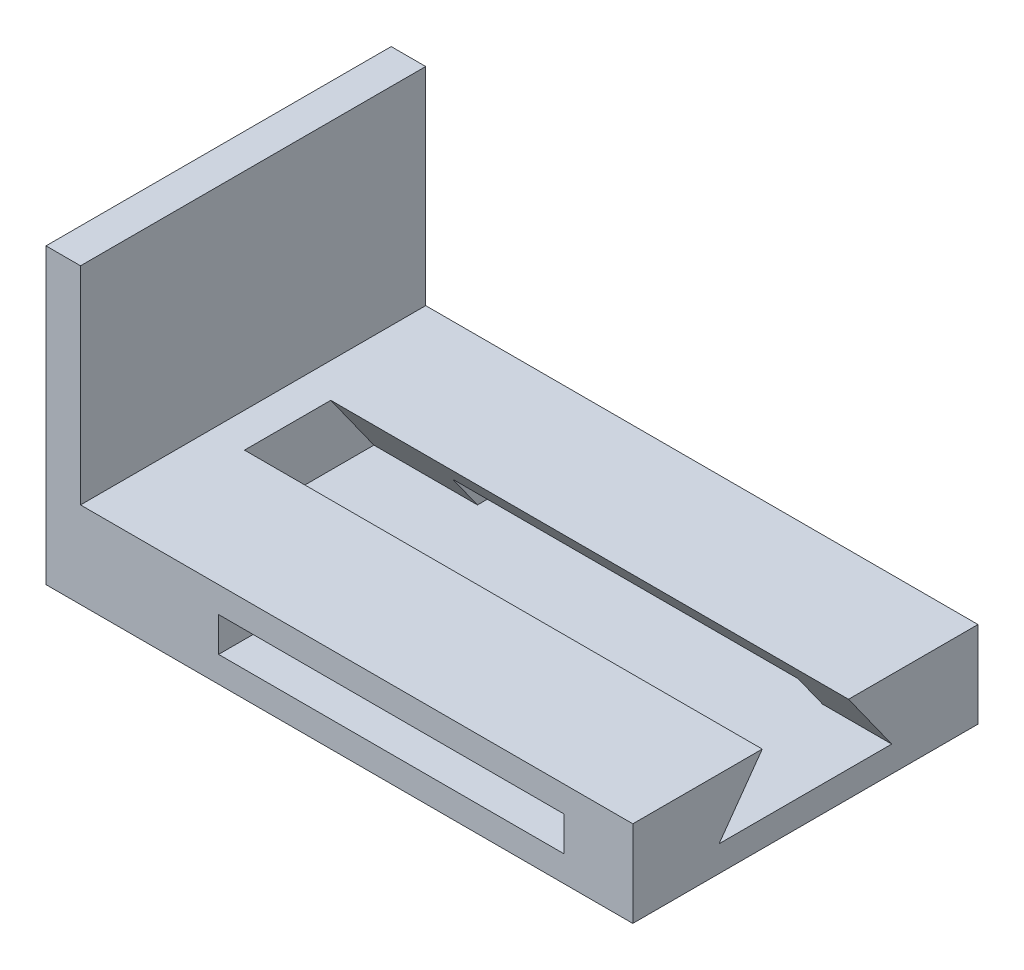
ISO-10303-21;
HEADER;
FILE_DESCRIPTION(('STEP AP214'),'2;1');
FILE_NAME('part.step','',(''),(''),'','','');
FILE_SCHEMA(('AUTOMOTIVE_DESIGN { 1 0 10303 214 1 1 1 1 }'));
ENDSEC;
DATA;
#1=APPLICATION_CONTEXT('core data for automotive mechanical design processes');
#2=APPLICATION_PROTOCOL_DEFINITION('international standard','automotive_design',2000,#1);
#3=PRODUCT_CONTEXT('',#1,'mechanical');
#4=PRODUCT('Part','Part','',(#3));
#5=PRODUCT_RELATED_PRODUCT_CATEGORY('part','',(#4));
#6=PRODUCT_DEFINITION_FORMATION('','',#4);
#7=PRODUCT_DEFINITION_CONTEXT('part definition',#1,'design');
#8=PRODUCT_DEFINITION('design','',#6,#7);
#9=PRODUCT_DEFINITION_SHAPE('','',#8);
#10=(LENGTH_UNIT() NAMED_UNIT(*) SI_UNIT(.MILLI.,.METRE.));
#11=(NAMED_UNIT(*) PLANE_ANGLE_UNIT() SI_UNIT($,.RADIAN.));
#12=(NAMED_UNIT(*) SI_UNIT($,.STERADIAN.) SOLID_ANGLE_UNIT());
#13=UNCERTAINTY_MEASURE_WITH_UNIT(LENGTH_MEASURE(1.E-05),#10,'distance_accuracy_value','');
#14=(GEOMETRIC_REPRESENTATION_CONTEXT(3) GLOBAL_UNCERTAINTY_ASSIGNED_CONTEXT((#13)) GLOBAL_UNIT_ASSIGNED_CONTEXT((#10,
#11,#12)) REPRESENTATION_CONTEXT('',''));
#15=CARTESIAN_POINT('',(0.,0.,0.));
#16=DIRECTION('',(0.,0.,1.));
#17=DIRECTION('',(1.,0.,0.));
#18=AXIS2_PLACEMENT_3D('',#15,#16,#17);
#19=CARTESIAN_POINT('',(2.,0.,0.));
#20=DIRECTION('',(0.,0.,-1.));
#21=DIRECTION('',(0.,1.,0.));
#22=AXIS2_PLACEMENT_3D('',#19,#20,#21);
#23=PLANE('',#22);
#24=DIRECTION('',(-1.,0.,0.));
#25=VECTOR('',#24,1.);
#26=CARTESIAN_POINT('',(10.,-15.5,0.));
#27=LINE('',#26,#25);
#28=CARTESIAN_POINT('',(30.,-15.5,0.));
#29=VERTEX_POINT('',#28);
#30=CARTESIAN_POINT('',(10.,-15.5,0.));
#31=VERTEX_POINT('',#30);
#32=EDGE_CURVE('E187',#29,#31,#27,.T.);
#33=ORIENTED_EDGE('',*,*,#32,.T.);
#34=DIRECTION('',(0.,1.,0.));
#35=VECTOR('',#34,1.);
#36=CARTESIAN_POINT('',(10.,-13.5,0.));
#37=LINE('',#36,#35);
#38=CARTESIAN_POINT('',(10.,-13.5,0.));
#39=VERTEX_POINT('',#38);
#40=EDGE_CURVE('E170',#31,#39,#37,.T.);
#41=ORIENTED_EDGE('',*,*,#40,.T.);
#42=DIRECTION('',(1.,0.,0.));
#43=VECTOR('',#42,1.);
#44=CARTESIAN_POINT('',(10.,-13.5,0.));
#45=LINE('',#44,#43);
#46=CARTESIAN_POINT('',(30.,-13.5,0.));
#47=VERTEX_POINT('',#46);
#48=EDGE_CURVE('E179',#39,#47,#45,.T.);
#49=ORIENTED_EDGE('',*,*,#48,.T.);
#50=DIRECTION('',(0.,-1.,0.));
#51=VECTOR('',#50,1.);
#52=CARTESIAN_POINT('',(30.,-13.5,0.));
#53=LINE('',#52,#51);
#54=EDGE_CURVE('E54',#47,#29,#53,.T.);
#55=ORIENTED_EDGE('',*,*,#54,.T.);
#56=EDGE_LOOP('',(#33,#41,#49,#55));
#57=FACE_BOUND('',#56,.T.);
#58=DIRECTION('',(0.,-1.,0.));
#59=VECTOR('',#58,1.);
#60=CARTESIAN_POINT('',(0.,0.,0.));
#61=LINE('',#60,#59);
#62=CARTESIAN_POINT('',(0.,0.,0.));
#63=VERTEX_POINT('',#62);
#64=CARTESIAN_POINT('',(0.,-17.,0.));
#65=VERTEX_POINT('',#64);
#66=EDGE_CURVE('E302',#63,#65,#61,.T.);
#67=ORIENTED_EDGE('',*,*,#66,.T.);
#68=DIRECTION('',(1.,0.,0.));
#69=VECTOR('',#68,1.);
#70=CARTESIAN_POINT('',(0.,-17.,0.));
#71=LINE('',#70,#69);
#72=CARTESIAN_POINT('',(34.,-17.,0.));
#73=VERTEX_POINT('',#72);
#74=EDGE_CURVE('E297',#65,#73,#71,.T.);
#75=ORIENTED_EDGE('',*,*,#74,.T.);
#76=DIRECTION('',(0.,-1.,0.));
#77=VECTOR('',#76,1.);
#78=CARTESIAN_POINT('',(34.,-12.,0.));
#79=LINE('',#78,#77);
#80=CARTESIAN_POINT('',(34.,-12.,0.));
#81=VERTEX_POINT('',#80);
#82=EDGE_CURVE('E264',#81,#73,#79,.T.);
#83=ORIENTED_EDGE('',*,*,#82,.F.);
#84=DIRECTION('',(1.,0.,0.));
#85=VECTOR('',#84,1.);
#86=CARTESIAN_POINT('',(0.,-12.,0.));
#87=LINE('',#86,#85);
#88=CARTESIAN_POINT('',(2.,-12.,0.));
#89=VERTEX_POINT('',#88);
#90=EDGE_CURVE('E298',#89,#81,#87,.T.);
#91=ORIENTED_EDGE('',*,*,#90,.F.);
#92=DIRECTION('',(0.,-1.,0.));
#93=VECTOR('',#92,1.);
#94=CARTESIAN_POINT('',(2.,0.,0.));
#95=LINE('',#94,#93);
#96=CARTESIAN_POINT('',(2.,0.,0.));
#97=VERTEX_POINT('',#96);
#98=EDGE_CURVE('E311',#97,#89,#95,.T.);
#99=ORIENTED_EDGE('',*,*,#98,.F.);
#100=DIRECTION('',(-1.,0.,0.));
#101=VECTOR('',#100,1.);
#102=CARTESIAN_POINT('',(2.,0.,0.));
#103=LINE('',#102,#101);
#104=EDGE_CURVE('E326',#97,#63,#103,.T.);
#105=ORIENTED_EDGE('',*,*,#104,.T.);
#106=EDGE_LOOP('',(#67,#75,#83,#91,#99,#105));
#107=FACE_BOUND('',#106,.T.);
#108=ADVANCED_FACE('F39',(#57,#107),#23,.F.);
#109=CARTESIAN_POINT('',(2.,0.,-20.));
#110=DIRECTION('',(0.,0.,1.));
#111=DIRECTION('',(1.,0.,0.));
#112=AXIS2_PLACEMENT_3D('',#109,#110,#111);
#113=PLANE('',#112);
#114=DIRECTION('',(1.,0.,0.));
#115=VECTOR('',#114,1.);
#116=CARTESIAN_POINT('',(10.,-13.5,-20.));
#117=LINE('',#116,#115);
#118=CARTESIAN_POINT('',(10.,-13.5,-20.));
#119=VERTEX_POINT('',#118);
#120=CARTESIAN_POINT('',(30.,-13.5,-20.));
#121=VERTEX_POINT('',#120);
#122=EDGE_CURVE('E202',#119,#121,#117,.T.);
#123=ORIENTED_EDGE('',*,*,#122,.F.);
#124=DIRECTION('',(0.,1.,0.));
#125=VECTOR('',#124,1.);
#126=CARTESIAN_POINT('',(10.,-13.5,-20.));
#127=LINE('',#126,#125);
#128=CARTESIAN_POINT('',(10.,-15.5,-20.));
#129=VERTEX_POINT('',#128);
#130=EDGE_CURVE('E62',#129,#119,#127,.T.);
#131=ORIENTED_EDGE('',*,*,#130,.F.);
#132=DIRECTION('',(-1.,0.,0.));
#133=VECTOR('',#132,1.);
#134=CARTESIAN_POINT('',(10.,-15.5,-20.));
#135=LINE('',#134,#133);
#136=CARTESIAN_POINT('',(30.,-15.5,-20.));
#137=VERTEX_POINT('',#136);
#138=EDGE_CURVE('E189',#137,#129,#135,.T.);
#139=ORIENTED_EDGE('',*,*,#138,.F.);
#140=DIRECTION('',(0.,-1.,0.));
#141=VECTOR('',#140,1.);
#142=CARTESIAN_POINT('',(30.,-13.5,-20.));
#143=LINE('',#142,#141);
#144=EDGE_CURVE('E193',#121,#137,#143,.T.);
#145=ORIENTED_EDGE('',*,*,#144,.F.);
#146=EDGE_LOOP('',(#123,#131,#139,#145));
#147=FACE_BOUND('',#146,.T.);
#148=DIRECTION('',(0.,1.,0.));
#149=VECTOR('',#148,1.);
#150=CARTESIAN_POINT('',(0.,0.,-20.));
#151=LINE('',#150,#149);
#152=CARTESIAN_POINT('',(0.,-17.,-20.));
#153=VERTEX_POINT('',#152);
#154=CARTESIAN_POINT('',(0.,0.,-20.));
#155=VERTEX_POINT('',#154);
#156=EDGE_CURVE('E329',#153,#155,#151,.T.);
#157=ORIENTED_EDGE('',*,*,#156,.T.);
#158=DIRECTION('',(-1.,0.,0.));
#159=VECTOR('',#158,1.);
#160=CARTESIAN_POINT('',(2.,0.,-20.));
#161=LINE('',#160,#159);
#162=CARTESIAN_POINT('',(2.,0.,-20.));
#163=VERTEX_POINT('',#162);
#164=EDGE_CURVE('E337',#163,#155,#161,.T.);
#165=ORIENTED_EDGE('',*,*,#164,.F.);
#166=DIRECTION('',(0.,1.,0.));
#167=VECTOR('',#166,1.);
#168=CARTESIAN_POINT('',(2.,0.,-20.));
#169=LINE('',#168,#167);
#170=CARTESIAN_POINT('',(2.,-12.,-20.));
#171=VERTEX_POINT('',#170);
#172=EDGE_CURVE('E320',#171,#163,#169,.T.);
#173=ORIENTED_EDGE('',*,*,#172,.F.);
#174=DIRECTION('',(1.,0.,0.));
#175=VECTOR('',#174,1.);
#176=CARTESIAN_POINT('',(0.,-12.,-20.));
#177=LINE('',#176,#175);
#178=CARTESIAN_POINT('',(34.,-12.,-20.));
#179=VERTEX_POINT('',#178);
#180=EDGE_CURVE('E303',#171,#179,#177,.T.);
#181=ORIENTED_EDGE('',*,*,#180,.T.);
#182=DIRECTION('',(0.,1.,0.));
#183=VECTOR('',#182,1.);
#184=CARTESIAN_POINT('',(34.,-12.,-20.));
#185=LINE('',#184,#183);
#186=CARTESIAN_POINT('',(34.,-17.,-20.));
#187=VERTEX_POINT('',#186);
#188=EDGE_CURVE('E284',#187,#179,#185,.T.);
#189=ORIENTED_EDGE('',*,*,#188,.F.);
#190=DIRECTION('',(1.,0.,0.));
#191=VECTOR('',#190,1.);
#192=CARTESIAN_POINT('',(0.,-17.,-20.));
#193=LINE('',#192,#191);
#194=EDGE_CURVE('E306',#153,#187,#193,.T.);
#195=ORIENTED_EDGE('',*,*,#194,.F.);
#196=EDGE_LOOP('',(#157,#165,#173,#181,#189,#195));
#197=FACE_BOUND('',#196,.T.);
#198=ADVANCED_FACE('F381',(#147,#197),#113,.F.);
#199=CARTESIAN_POINT('',(2.,0.,0.));
#200=DIRECTION('',(0.,-1.,0.));
#201=DIRECTION('',(0.,0.,-1.));
#202=AXIS2_PLACEMENT_3D('',#199,#200,#201);
#203=PLANE('',#202);
#204=DIRECTION('',(0.,0.,1.));
#205=VECTOR('',#204,1.);
#206=CARTESIAN_POINT('',(0.,0.,0.));
#207=LINE('',#206,#205);
#208=EDGE_CURVE('E316',#155,#63,#207,.T.);
#209=ORIENTED_EDGE('',*,*,#208,.T.);
#210=ORIENTED_EDGE('',*,*,#104,.F.);
#211=DIRECTION('',(0.,0.,1.));
#212=VECTOR('',#211,1.);
#213=CARTESIAN_POINT('',(2.,0.,0.));
#214=LINE('',#213,#212);
#215=EDGE_CURVE('E323',#163,#97,#214,.T.);
#216=ORIENTED_EDGE('',*,*,#215,.F.);
#217=ORIENTED_EDGE('',*,*,#164,.T.);
#218=EDGE_LOOP('',(#209,#210,#216,#217));
#219=FACE_BOUND('',#218,.T.);
#220=ADVANCED_FACE('F401',(#219),#203,.F.);
#221=CARTESIAN_POINT('',(2.,0.,0.));
#222=DIRECTION('',(1.,0.,0.));
#223=DIRECTION('',(0.,0.,-1.));
#224=AXIS2_PLACEMENT_3D('',#221,#222,#223);
#225=PLANE('',#224);
#226=ORIENTED_EDGE('',*,*,#98,.T.);
#227=DIRECTION('',(0.,0.,-1.));
#228=VECTOR('',#227,1.);
#229=CARTESIAN_POINT('',(2.,-12.,0.));
#230=LINE('',#229,#228);
#231=EDGE_CURVE('E315',#89,#171,#230,.T.);
#232=ORIENTED_EDGE('',*,*,#231,.T.);
#233=ORIENTED_EDGE('',*,*,#172,.T.);
#234=ORIENTED_EDGE('',*,*,#215,.T.);
#235=EDGE_LOOP('',(#226,#232,#233,#234));
#236=FACE_BOUND('',#235,.T.);
#237=ADVANCED_FACE('F405',(#236),#225,.T.);
#238=CARTESIAN_POINT('',(0.,0.,0.));
#239=DIRECTION('',(1.,0.,0.));
#240=DIRECTION('',(0.,0.,-1.));
#241=AXIS2_PLACEMENT_3D('',#238,#239,#240);
#242=PLANE('',#241);
#243=ORIENTED_EDGE('',*,*,#66,.F.);
#244=ORIENTED_EDGE('',*,*,#208,.F.);
#245=ORIENTED_EDGE('',*,*,#156,.F.);
#246=DIRECTION('',(0.,0.,-1.));
#247=VECTOR('',#246,1.);
#248=CARTESIAN_POINT('',(0.,-17.,0.));
#249=LINE('',#248,#247);
#250=EDGE_CURVE('E293',#65,#153,#249,.T.);
#251=ORIENTED_EDGE('',*,*,#250,.F.);
#252=EDGE_LOOP('',(#243,#244,#245,#251));
#253=FACE_BOUND('',#252,.T.);
#254=ADVANCED_FACE('F409',(#253),#242,.F.);
#255=CARTESIAN_POINT('',(0.,-12.,0.));
#256=DIRECTION('',(0.,1.,0.));
#257=DIRECTION('',(0.,0.,1.));
#258=AXIS2_PLACEMENT_3D('',#255,#256,#257);
#259=PLANE('',#258);
#260=DIRECTION('',(1.,0.,0.));
#261=VECTOR('',#260,1.);
#262=CARTESIAN_POINT('',(4.,-12.,-12.5));
#263=LINE('',#262,#261);
#264=CARTESIAN_POINT('',(4.,-12.,-12.5));
#265=VERTEX_POINT('',#264);
#266=CARTESIAN_POINT('',(34.,-12.,-12.5));
#267=VERTEX_POINT('',#266);
#268=EDGE_CURVE('E250',#265,#267,#263,.T.);
#269=ORIENTED_EDGE('',*,*,#268,.T.);
#270=DIRECTION('',(0.,0.,1.));
#271=VECTOR('',#270,1.);
#272=CARTESIAN_POINT('',(34.,-12.,0.));
#273=LINE('',#272,#271);
#274=EDGE_CURVE('E289',#179,#267,#273,.T.);
#275=ORIENTED_EDGE('',*,*,#274,.F.);
#276=ORIENTED_EDGE('',*,*,#180,.F.);
#277=ORIENTED_EDGE('',*,*,#231,.F.);
#278=ORIENTED_EDGE('',*,*,#90,.T.);
#279=CARTESIAN_POINT('',(34.,-12.,-7.5));
#280=VERTEX_POINT('',#279);
#281=EDGE_CURVE('E288',#280,#81,#273,.T.);
#282=ORIENTED_EDGE('',*,*,#281,.F.);
#283=DIRECTION('',(1.,0.,0.));
#284=VECTOR('',#283,1.);
#285=CARTESIAN_POINT('',(4.,-12.,-7.5));
#286=LINE('',#285,#284);
#287=CARTESIAN_POINT('',(4.,-12.,-7.5));
#288=VERTEX_POINT('',#287);
#289=EDGE_CURVE('E271',#288,#280,#286,.T.);
#290=ORIENTED_EDGE('',*,*,#289,.F.);
#291=DIRECTION('',(0.,0.,1.));
#292=VECTOR('',#291,1.);
#293=CARTESIAN_POINT('',(4.,-12.,-7.5));
#294=LINE('',#293,#292);
#295=EDGE_CURVE('E237',#265,#288,#294,.T.);
#296=ORIENTED_EDGE('',*,*,#295,.F.);
#297=EDGE_LOOP('',(#269,#275,#276,#277,#278,#282,#290,#296));
#298=FACE_BOUND('',#297,.T.);
#299=ADVANCED_FACE('F362',(#298),#259,.T.);
#300=CARTESIAN_POINT('',(0.,-17.,0.));
#301=DIRECTION('',(0.,-1.,0.));
#302=DIRECTION('',(0.,0.,-1.));
#303=AXIS2_PLACEMENT_3D('',#300,#301,#302);
#304=PLANE('',#303);
#305=ORIENTED_EDGE('',*,*,#194,.T.);
#306=DIRECTION('',(0.,0.,-1.));
#307=VECTOR('',#306,1.);
#308=CARTESIAN_POINT('',(34.,-17.,0.));
#309=LINE('',#308,#307);
#310=EDGE_CURVE('E280',#73,#187,#309,.T.);
#311=ORIENTED_EDGE('',*,*,#310,.F.);
#312=ORIENTED_EDGE('',*,*,#74,.F.);
#313=ORIENTED_EDGE('',*,*,#250,.T.);
#314=EDGE_LOOP('',(#305,#311,#312,#313));
#315=FACE_BOUND('',#314,.T.);
#316=ADVANCED_FACE('F416',(#315),#304,.T.);
#317=CARTESIAN_POINT('',(34.,0.,0.));
#318=DIRECTION('',(1.,0.,0.));
#319=DIRECTION('',(0.,0.,-1.));
#320=AXIS2_PLACEMENT_3D('',#317,#318,#319);
#321=PLANE('',#320);
#322=DIRECTION('',(0.,0.813733471206735,0.581238193719096));
#323=VECTOR('',#322,1.);
#324=CARTESIAN_POINT('',(34.,-12.,-12.5));
#325=LINE('',#324,#323);
#326=CARTESIAN_POINT('',(34.,-15.5,-15.));
#327=VERTEX_POINT('',#326);
#328=EDGE_CURVE('E232',#327,#267,#325,.T.);
#329=ORIENTED_EDGE('',*,*,#328,.F.);
#330=DIRECTION('',(0.,0.,-1.));
#331=VECTOR('',#330,1.);
#332=CARTESIAN_POINT('',(34.,-15.5,-5.));
#333=LINE('',#332,#331);
#334=CARTESIAN_POINT('',(34.,-15.5,-5.));
#335=VERTEX_POINT('',#334);
#336=EDGE_CURVE('E238',#335,#327,#333,.T.);
#337=ORIENTED_EDGE('',*,*,#336,.F.);
#338=DIRECTION('',(0.,-0.813733471206735,0.581238193719097));
#339=VECTOR('',#338,1.);
#340=CARTESIAN_POINT('',(34.,-15.5,-5.));
#341=LINE('',#340,#339);
#342=EDGE_CURVE('E253',#280,#335,#341,.T.);
#343=ORIENTED_EDGE('',*,*,#342,.F.);
#344=ORIENTED_EDGE('',*,*,#281,.T.);
#345=ORIENTED_EDGE('',*,*,#82,.T.);
#346=ORIENTED_EDGE('',*,*,#310,.T.);
#347=ORIENTED_EDGE('',*,*,#188,.T.);
#348=ORIENTED_EDGE('',*,*,#274,.T.);
#349=EDGE_LOOP('',(#329,#337,#343,#344,#345,#346,#347,#348));
#350=FACE_BOUND('',#349,.T.);
#351=ADVANCED_FACE('F369',(#350),#321,.T.);
#352=CARTESIAN_POINT('',(4.,-12.,-12.5));
#353=DIRECTION('',(0.,0.581238193719096,-0.813733471206735));
#354=DIRECTION('',(0.,0.813733471206735,0.581238193719096));
#355=AXIS2_PLACEMENT_3D('',#352,#353,#354);
#356=PLANE('',#355);
#357=DIRECTION('',(1.,0.,0.));
#358=VECTOR('',#357,1.);
#359=CARTESIAN_POINT('',(4.,-15.5,-15.));
#360=LINE('',#359,#358);
#361=CARTESIAN_POINT('',(4.,-15.5,-15.));
#362=VERTEX_POINT('',#361);
#363=CARTESIAN_POINT('',(10.,-15.5,-15.));
#364=VERTEX_POINT('',#363);
#365=EDGE_CURVE('E260',#362,#364,#360,.T.);
#366=ORIENTED_EDGE('',*,*,#365,.T.);
#367=DIRECTION('',(0.,0.813733471206735,0.581238193719096));
#368=VECTOR('',#367,1.);
#369=CARTESIAN_POINT('',(10.,-12.,-12.5));
#370=LINE('',#369,#368);
#371=CARTESIAN_POINT('',(10.,-13.5,-13.5714285714286));
#372=VERTEX_POINT('',#371);
#373=EDGE_CURVE('E228',#364,#372,#370,.T.);
#374=ORIENTED_EDGE('',*,*,#373,.T.);
#375=DIRECTION('',(1.,0.,0.));
#376=VECTOR('',#375,1.);
#377=CARTESIAN_POINT('',(4.,-13.5,-13.5714285714286));
#378=LINE('',#377,#376);
#379=CARTESIAN_POINT('',(30.,-13.5,-13.5714285714286));
#380=VERTEX_POINT('',#379);
#381=EDGE_CURVE('E212',#372,#380,#378,.T.);
#382=ORIENTED_EDGE('',*,*,#381,.T.);
#383=DIRECTION('',(0.,-0.813733471206735,-0.581238193719096));
#384=VECTOR('',#383,1.);
#385=CARTESIAN_POINT('',(30.,-12.,-12.5));
#386=LINE('',#385,#384);
#387=CARTESIAN_POINT('',(30.,-15.5,-15.));
#388=VERTEX_POINT('',#387);
#389=EDGE_CURVE('E224',#380,#388,#386,.T.);
#390=ORIENTED_EDGE('',*,*,#389,.T.);
#391=EDGE_CURVE('E265',#388,#327,#360,.T.);
#392=ORIENTED_EDGE('',*,*,#391,.T.);
#393=ORIENTED_EDGE('',*,*,#328,.T.);
#394=ORIENTED_EDGE('',*,*,#268,.F.);
#395=DIRECTION('',(0.,0.813733471206735,0.581238193719096));
#396=VECTOR('',#395,1.);
#397=CARTESIAN_POINT('',(4.,-12.,-12.5));
#398=LINE('',#397,#396);
#399=EDGE_CURVE('E233',#362,#265,#398,.T.);
#400=ORIENTED_EDGE('',*,*,#399,.F.);
#401=EDGE_LOOP('',(#366,#374,#382,#390,#392,#393,#394,#400));
#402=FACE_BOUND('',#401,.T.);
#403=ADVANCED_FACE('F360',(#402),#356,.F.);
#404=CARTESIAN_POINT('',(4.,-15.5,-5.));
#405=DIRECTION('',(0.,-1.,0.));
#406=DIRECTION('',(0.,0.,-1.));
#407=AXIS2_PLACEMENT_3D('',#404,#405,#406);
#408=PLANE('',#407);
#409=ORIENTED_EDGE('',*,*,#391,.F.);
#410=DIRECTION('',(0.,0.,-1.));
#411=VECTOR('',#410,1.);
#412=CARTESIAN_POINT('',(30.,-15.5,0.));
#413=LINE('',#412,#411);
#414=EDGE_CURVE('E218',#388,#137,#413,.T.);
#415=ORIENTED_EDGE('',*,*,#414,.T.);
#416=ORIENTED_EDGE('',*,*,#138,.T.);
#417=DIRECTION('',(0.,0.,-1.));
#418=VECTOR('',#417,1.);
#419=CARTESIAN_POINT('',(10.,-15.5,0.));
#420=LINE('',#419,#418);
#421=EDGE_CURVE('E213',#364,#129,#420,.T.);
#422=ORIENTED_EDGE('',*,*,#421,.F.);
#423=ORIENTED_EDGE('',*,*,#365,.F.);
#424=DIRECTION('',(0.,0.,-1.));
#425=VECTOR('',#424,1.);
#426=CARTESIAN_POINT('',(4.,-15.5,-5.));
#427=LINE('',#426,#425);
#428=CARTESIAN_POINT('',(4.,-15.5,-5.));
#429=VERTEX_POINT('',#428);
#430=EDGE_CURVE('E246',#429,#362,#427,.T.);
#431=ORIENTED_EDGE('',*,*,#430,.F.);
#432=DIRECTION('',(1.,0.,0.));
#433=VECTOR('',#432,1.);
#434=CARTESIAN_POINT('',(4.,-15.5,-5.));
#435=LINE('',#434,#433);
#436=CARTESIAN_POINT('',(10.,-15.5,-5.));
#437=VERTEX_POINT('',#436);
#438=EDGE_CURVE('E266',#429,#437,#435,.T.);
#439=ORIENTED_EDGE('',*,*,#438,.T.);
#440=EDGE_CURVE('E209',#31,#437,#420,.T.);
#441=ORIENTED_EDGE('',*,*,#440,.F.);
#442=ORIENTED_EDGE('',*,*,#32,.F.);
#443=CARTESIAN_POINT('',(30.,-15.5,-5.));
#444=VERTEX_POINT('',#443);
#445=EDGE_CURVE('E214',#29,#444,#413,.T.);
#446=ORIENTED_EDGE('',*,*,#445,.T.);
#447=EDGE_CURVE('E270',#444,#335,#435,.T.);
#448=ORIENTED_EDGE('',*,*,#447,.T.);
#449=ORIENTED_EDGE('',*,*,#336,.T.);
#450=EDGE_LOOP('',(#409,#415,#416,#422,#423,#431,#439,#441,#442,#446,#448,#449));
#451=FACE_BOUND('',#450,.T.);
#452=ADVANCED_FACE('F351',(#451),#408,.F.);
#453=CARTESIAN_POINT('',(4.,-15.5,-5.));
#454=DIRECTION('',(0.,0.581238193719097,0.813733471206735));
#455=DIRECTION('',(0.,-0.813733471206735,0.581238193719097));
#456=AXIS2_PLACEMENT_3D('',#453,#454,#455);
#457=PLANE('',#456);
#458=DIRECTION('',(-1.,0.,0.));
#459=VECTOR('',#458,1.);
#460=CARTESIAN_POINT('',(4.,-13.5,-6.42857142857143));
#461=LINE('',#460,#459);
#462=CARTESIAN_POINT('',(30.,-13.5,-6.42857142857143));
#463=VERTEX_POINT('',#462);
#464=CARTESIAN_POINT('',(10.,-13.5,-6.42857142857143));
#465=VERTEX_POINT('',#464);
#466=EDGE_CURVE('E341',#463,#465,#461,.T.);
#467=ORIENTED_EDGE('',*,*,#466,.T.);
#468=DIRECTION('',(0.,-0.813733471206735,0.581238193719097));
#469=VECTOR('',#468,1.);
#470=CARTESIAN_POINT('',(10.,-15.5,-5.));
#471=LINE('',#470,#469);
#472=EDGE_CURVE('E11',#465,#437,#471,.T.);
#473=ORIENTED_EDGE('',*,*,#472,.T.);
#474=ORIENTED_EDGE('',*,*,#438,.F.);
#475=DIRECTION('',(0.,-0.813733471206735,0.581238193719097));
#476=VECTOR('',#475,1.);
#477=CARTESIAN_POINT('',(4.,-15.5,-5.));
#478=LINE('',#477,#476);
#479=EDGE_CURVE('E242',#288,#429,#478,.T.);
#480=ORIENTED_EDGE('',*,*,#479,.F.);
#481=ORIENTED_EDGE('',*,*,#289,.T.);
#482=ORIENTED_EDGE('',*,*,#342,.T.);
#483=ORIENTED_EDGE('',*,*,#447,.F.);
#484=DIRECTION('',(0.,0.813733471206735,-0.581238193719097));
#485=VECTOR('',#484,1.);
#486=CARTESIAN_POINT('',(30.,-15.5,-5.));
#487=LINE('',#486,#485);
#488=EDGE_CURVE('E47',#444,#463,#487,.T.);
#489=ORIENTED_EDGE('',*,*,#488,.T.);
#490=EDGE_LOOP('',(#467,#473,#474,#480,#481,#482,#483,#489));
#491=FACE_BOUND('',#490,.T.);
#492=ADVANCED_FACE('F347',(#491),#457,.F.);
#493=CARTESIAN_POINT('',(4.,0.,0.));
#494=DIRECTION('',(1.,0.,0.));
#495=DIRECTION('',(0.,0.,-1.));
#496=AXIS2_PLACEMENT_3D('',#493,#494,#495);
#497=PLANE('',#496);
#498=ORIENTED_EDGE('',*,*,#399,.T.);
#499=ORIENTED_EDGE('',*,*,#295,.T.);
#500=ORIENTED_EDGE('',*,*,#479,.T.);
#501=ORIENTED_EDGE('',*,*,#430,.T.);
#502=EDGE_LOOP('',(#498,#499,#500,#501));
#503=FACE_BOUND('',#502,.T.);
#504=ADVANCED_FACE('F354',(#503),#497,.T.);
#505=CARTESIAN_POINT('',(10.,-13.5,0.));
#506=DIRECTION('',(0.,1.,0.));
#507=DIRECTION('',(-1.,0.,0.));
#508=AXIS2_PLACEMENT_3D('',#505,#506,#507);
#509=PLANE('',#508);
#510=DIRECTION('',(0.,0.,-1.));
#511=VECTOR('',#510,1.);
#512=CARTESIAN_POINT('',(30.,-13.5,0.));
#513=LINE('',#512,#511);
#514=EDGE_CURVE('E181',#47,#463,#513,.T.);
#515=ORIENTED_EDGE('',*,*,#514,.F.);
#516=ORIENTED_EDGE('',*,*,#48,.F.);
#517=DIRECTION('',(0.,0.,-1.));
#518=VECTOR('',#517,1.);
#519=CARTESIAN_POINT('',(10.,-13.5,0.));
#520=LINE('',#519,#518);
#521=EDGE_CURVE('E166',#39,#465,#520,.T.);
#522=ORIENTED_EDGE('',*,*,#521,.T.);
#523=ORIENTED_EDGE('',*,*,#466,.F.);
#524=EDGE_LOOP('',(#515,#516,#522,#523));
#525=FACE_BOUND('',#524,.T.);
#526=ADVANCED_FACE('F180',(#525),#509,.F.);
#527=CARTESIAN_POINT('',(30.,-13.5,0.));
#528=DIRECTION('',(1.,0.,0.));
#529=DIRECTION('',(0.,0.,-1.));
#530=AXIS2_PLACEMENT_3D('',#527,#528,#529);
#531=PLANE('',#530);
#532=ORIENTED_EDGE('',*,*,#445,.F.);
#533=ORIENTED_EDGE('',*,*,#54,.F.);
#534=ORIENTED_EDGE('',*,*,#514,.T.);
#535=ORIENTED_EDGE('',*,*,#488,.F.);
#536=EDGE_LOOP('',(#532,#533,#534,#535));
#537=FACE_BOUND('',#536,.T.);
#538=ADVANCED_FACE('F348',(#537),#531,.F.);
#539=CARTESIAN_POINT('',(10.,-13.5,0.));
#540=DIRECTION('',(-1.,0.,0.));
#541=DIRECTION('',(0.,0.,1.));
#542=AXIS2_PLACEMENT_3D('',#539,#540,#541);
#543=PLANE('',#542);
#544=ORIENTED_EDGE('',*,*,#521,.F.);
#545=ORIENTED_EDGE('',*,*,#40,.F.);
#546=ORIENTED_EDGE('',*,*,#440,.T.);
#547=ORIENTED_EDGE('',*,*,#472,.F.);
#548=EDGE_LOOP('',(#544,#545,#546,#547));
#549=FACE_BOUND('',#548,.T.);
#550=ADVANCED_FACE('F168',(#549),#543,.F.);
#551=ORIENTED_EDGE('',*,*,#421,.T.);
#552=ORIENTED_EDGE('',*,*,#130,.T.);
#553=EDGE_CURVE('E176',#372,#119,#520,.T.);
#554=ORIENTED_EDGE('',*,*,#553,.F.);
#555=ORIENTED_EDGE('',*,*,#373,.F.);
#556=EDGE_LOOP('',(#551,#552,#554,#555));
#557=FACE_BOUND('',#556,.T.);
#558=ADVANCED_FACE('F387',(#557),#543,.F.);
#559=EDGE_CURVE('E175',#380,#121,#513,.T.);
#560=ORIENTED_EDGE('',*,*,#559,.T.);
#561=ORIENTED_EDGE('',*,*,#144,.T.);
#562=ORIENTED_EDGE('',*,*,#414,.F.);
#563=ORIENTED_EDGE('',*,*,#389,.F.);
#564=EDGE_LOOP('',(#560,#561,#562,#563));
#565=FACE_BOUND('',#564,.T.);
#566=ADVANCED_FACE('F385',(#565),#531,.F.);
#567=ORIENTED_EDGE('',*,*,#553,.T.);
#568=ORIENTED_EDGE('',*,*,#122,.T.);
#569=ORIENTED_EDGE('',*,*,#559,.F.);
#570=ORIENTED_EDGE('',*,*,#381,.F.);
#571=EDGE_LOOP('',(#567,#568,#569,#570));
#572=FACE_BOUND('',#571,.T.);
#573=ADVANCED_FACE('F378',(#572),#509,.F.);
#574=CLOSED_SHELL('',(#108,#198,#220,#237,#254,#299,#316,#351,#403,#452,#492,#504,#526,#538,
#550,#558,#566,#573));
#575=MANIFOLD_SOLID_BREP('B2',#574);
#576=ADVANCED_BREP_SHAPE_REPRESENTATION('',(#18,#575),#14);
#577=SHAPE_DEFINITION_REPRESENTATION(#9,#576);
ENDSEC;
END-ISO-10303-21;
